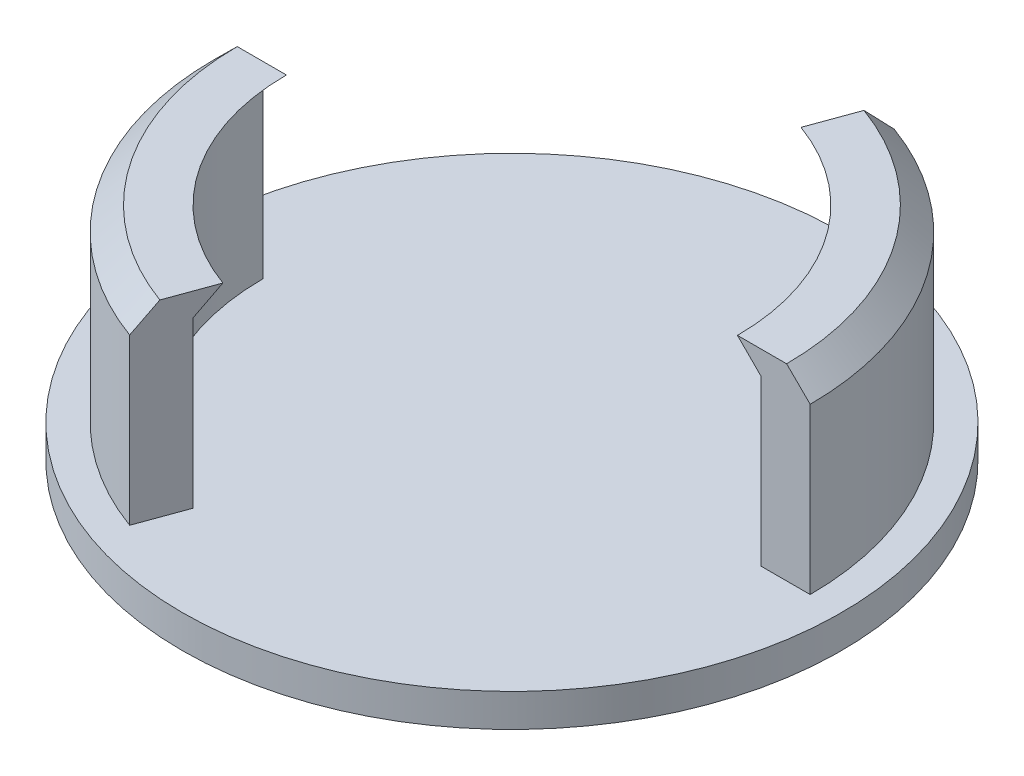
ISO-10303-21;
HEADER;
FILE_DESCRIPTION(('STEP AP214'),'2;1');
FILE_NAME('part.step','',(''),(''),'','','');
FILE_SCHEMA(('AUTOMOTIVE_DESIGN { 1 0 10303 214 1 1 1 1 }'));
ENDSEC;
DATA;
#1=APPLICATION_CONTEXT('core data for automotive mechanical design processes');
#2=APPLICATION_PROTOCOL_DEFINITION('international standard','automotive_design',2000,#1);
#3=PRODUCT_CONTEXT('',#1,'mechanical');
#4=PRODUCT('Part','Part','',(#3));
#5=PRODUCT_RELATED_PRODUCT_CATEGORY('part','',(#4));
#6=PRODUCT_DEFINITION_FORMATION('','',#4);
#7=PRODUCT_DEFINITION_CONTEXT('part definition',#1,'design');
#8=PRODUCT_DEFINITION('design','',#6,#7);
#9=PRODUCT_DEFINITION_SHAPE('','',#8);
#10=(LENGTH_UNIT() NAMED_UNIT(*) SI_UNIT(.MILLI.,.METRE.));
#11=(NAMED_UNIT(*) PLANE_ANGLE_UNIT() SI_UNIT($,.RADIAN.));
#12=(NAMED_UNIT(*) SI_UNIT($,.STERADIAN.) SOLID_ANGLE_UNIT());
#13=UNCERTAINTY_MEASURE_WITH_UNIT(LENGTH_MEASURE(1.E-05),#10,'distance_accuracy_value','');
#14=(GEOMETRIC_REPRESENTATION_CONTEXT(3) GLOBAL_UNCERTAINTY_ASSIGNED_CONTEXT((#13)) GLOBAL_UNIT_ASSIGNED_CONTEXT((#10,
#11,#12)) REPRESENTATION_CONTEXT('',''));
#15=CARTESIAN_POINT('',(0.,0.,0.));
#16=DIRECTION('',(0.,0.,1.));
#17=DIRECTION('',(1.,0.,0.));
#18=AXIS2_PLACEMENT_3D('',#15,#16,#17);
#19=CARTESIAN_POINT('',(0.,2.,0.));
#20=DIRECTION('',(0.,1.,0.));
#21=DIRECTION('',(0.,0.,1.));
#22=AXIS2_PLACEMENT_3D('',#19,#20,#21);
#23=PLANE('',#22);
#24=DIRECTION('',(-0.342020143325666,0.,0.939692620785909));
#25=VECTOR('',#24,1.);
#26=CARTESIAN_POINT('',(0.,2.,0.));
#27=LINE('',#26,#25);
#28=CARTESIAN_POINT('',(-5.16450416421756,2.00000000000001,14.1893585738672));
#29=VERTEX_POINT('',#28);
#30=CARTESIAN_POINT('',(-6.19056459419456,2.00000000000001,17.008436436225));
#31=VERTEX_POINT('',#30);
#32=EDGE_CURVE('E168',#29,#31,#27,.T.);
#33=ORIENTED_EDGE('',*,*,#32,.T.);
#34=CARTESIAN_POINT('',(0.,2.00000000000001,0.));
#35=DIRECTION('',(0.,-1.,0.));
#36=DIRECTION('',(0.,0.,-1.));
#37=AXIS2_PLACEMENT_3D('',#34,#35,#36);
#38=CIRCLE('',#37,18.1);
#39=CARTESIAN_POINT('',(-18.1,2.00000000000001,0.));
#40=VERTEX_POINT('',#39);
#41=EDGE_CURVE('E172',#31,#40,#38,.T.);
#42=ORIENTED_EDGE('',*,*,#41,.T.);
#43=DIRECTION('',(-1.,0.,0.));
#44=VECTOR('',#43,1.);
#45=CARTESIAN_POINT('',(0.,2.,0.));
#46=LINE('',#45,#44);
#47=CARTESIAN_POINT('',(-15.1,2.,0.));
#48=VERTEX_POINT('',#47);
#49=EDGE_CURVE('E154',#48,#40,#46,.T.);
#50=ORIENTED_EDGE('',*,*,#49,.F.);
#51=CARTESIAN_POINT('',(0.,2.00000000000001,0.));
#52=DIRECTION('',(0.,-1.,0.));
#53=DIRECTION('',(0.,0.,-1.));
#54=AXIS2_PLACEMENT_3D('',#51,#52,#53);
#55=CIRCLE('',#54,15.1);
#56=EDGE_CURVE('E139',#29,#48,#55,.T.);
#57=ORIENTED_EDGE('',*,*,#56,.F.);
#58=EDGE_LOOP('',(#33,#42,#50,#57));
#59=FACE_BOUND('',#58,.T.);
#60=CARTESIAN_POINT('',(0.,2.,0.));
#61=DIRECTION('',(0.,1.,0.));
#62=DIRECTION('',(0.,0.,1.));
#63=AXIS2_PLACEMENT_3D('',#60,#61,#62);
#64=CIRCLE('',#63,20.);
#65=CARTESIAN_POINT('',(0.,2.,20.));
#66=VERTEX_POINT('',#65);
#67=EDGE_CURVE('E11',#66,#66,#64,.T.);
#68=ORIENTED_EDGE('',*,*,#67,.T.);
#69=EDGE_LOOP('',(#68));
#70=FACE_BOUND('',#69,.T.);
#71=CARTESIAN_POINT('',(0.,2.00000000000001,0.));
#72=DIRECTION('',(0.,-1.,0.));
#73=DIRECTION('',(0.,0.,-1.));
#74=AXIS2_PLACEMENT_3D('',#71,#72,#73);
#75=CIRCLE('',#74,15.1);
#76=CARTESIAN_POINT('',(5.16450416421756,2.,-14.1893585738672));
#77=VERTEX_POINT('',#76);
#78=CARTESIAN_POINT('',(15.1,2.,0.));
#79=VERTEX_POINT('',#78);
#80=EDGE_CURVE('E58',#77,#79,#75,.T.);
#81=ORIENTED_EDGE('',*,*,#80,.F.);
#82=DIRECTION('',(0.342020143325666,0.,-0.939692620785909));
#83=VECTOR('',#82,1.);
#84=CARTESIAN_POINT('',(0.,2.,0.));
#85=LINE('',#84,#83);
#86=CARTESIAN_POINT('',(6.19056459419456,2.,-17.008436436225));
#87=VERTEX_POINT('',#86);
#88=EDGE_CURVE('E209',#77,#87,#85,.T.);
#89=ORIENTED_EDGE('',*,*,#88,.T.);
#90=CARTESIAN_POINT('',(0.,2.00000000000001,0.));
#91=DIRECTION('',(0.,-1.,0.));
#92=DIRECTION('',(0.,0.,-1.));
#93=AXIS2_PLACEMENT_3D('',#90,#91,#92);
#94=CIRCLE('',#93,18.1);
#95=CARTESIAN_POINT('',(18.1,2.00000000000001,0.));
#96=VERTEX_POINT('',#95);
#97=EDGE_CURVE('E216',#87,#96,#94,.T.);
#98=ORIENTED_EDGE('',*,*,#97,.T.);
#99=DIRECTION('',(1.,0.,0.));
#100=VECTOR('',#99,1.);
#101=CARTESIAN_POINT('',(0.,2.,0.));
#102=LINE('',#101,#100);
#103=EDGE_CURVE('E191',#79,#96,#102,.T.);
#104=ORIENTED_EDGE('',*,*,#103,.F.);
#105=EDGE_LOOP('',(#81,#89,#98,#104));
#106=FACE_BOUND('',#105,.T.);
#107=ADVANCED_FACE('F35',(#59,#70,#106),#23,.T.);
#108=CARTESIAN_POINT('',(0.,2.,0.));
#109=DIRECTION('',(0.,-1.,0.));
#110=DIRECTION('',(0.,0.,-1.));
#111=AXIS2_PLACEMENT_3D('',#108,#109,#110);
#112=CYLINDRICAL_SURFACE('',#111,20.);
#113=ORIENTED_EDGE('',*,*,#67,.F.);
#114=EDGE_LOOP('',(#113));
#115=FACE_BOUND('',#114,.T.);
#116=CARTESIAN_POINT('',(0.,0.,0.));
#117=DIRECTION('',(0.,1.,0.));
#118=DIRECTION('',(0.,0.,1.));
#119=AXIS2_PLACEMENT_3D('',#116,#117,#118);
#120=CIRCLE('',#119,20.);
#121=CARTESIAN_POINT('',(0.,0.,20.));
#122=VERTEX_POINT('',#121);
#123=EDGE_CURVE('E39',#122,#122,#120,.T.);
#124=ORIENTED_EDGE('',*,*,#123,.T.);
#125=EDGE_LOOP('',(#124));
#126=FACE_BOUND('',#125,.T.);
#127=ADVANCED_FACE('F37',(#115,#126),#112,.T.);
#128=CARTESIAN_POINT('',(0.,0.,0.));
#129=DIRECTION('',(0.,1.,0.));
#130=DIRECTION('',(0.,0.,1.));
#131=AXIS2_PLACEMENT_3D('',#128,#129,#130);
#132=PLANE('',#131);
#133=ORIENTED_EDGE('',*,*,#123,.F.);
#134=EDGE_LOOP('',(#133));
#135=FACE_BOUND('',#134,.T.);
#136=ADVANCED_FACE('F230',(#135),#132,.F.);
#137=CARTESIAN_POINT('',(0.,12.,0.));
#138=DIRECTION('',(0.,-1.,0.));
#139=DIRECTION('',(0.,0.,-1.));
#140=AXIS2_PLACEMENT_3D('',#137,#138,#139);
#141=CONICAL_SURFACE('',#140,18.1,0.790976046850301);
#142=CARTESIAN_POINT('',(0.,13.4142135623731,0.));
#143=DIRECTION('',(0.,-1.,0.));
#144=DIRECTION('',(0.,0.,-1.));
#145=AXIS2_PLACEMENT_3D('',#142,#143,#144);
#146=CIRCLE('',#145,16.669921141459);
#147=CARTESIAN_POINT('',(5.70144881802937,13.4142135623731,-15.6646018857121));
#148=VERTEX_POINT('',#147);
#149=CARTESIAN_POINT('',(16.669921141459,13.4142135623731,0.));
#150=VERTEX_POINT('',#149);
#151=EDGE_CURVE('E223',#148,#150,#146,.T.);
#152=ORIENTED_EDGE('',*,*,#151,.T.);
#153=DIRECTION('',(-0.711039919946778,0.703151642422942,0.));
#154=VECTOR('',#153,1.);
#155=CARTESIAN_POINT('',(14.9486690540479,15.1163700775483,0.));
#156=LINE('',#155,#154);
#157=CARTESIAN_POINT('',(18.1,12.,0.));
#158=VERTEX_POINT('',#157);
#159=EDGE_CURVE('E134',#158,#150,#156,.T.);
#160=ORIENTED_EDGE('',*,*,#159,.F.);
#161=CARTESIAN_POINT('',(0.,12.,0.));
#162=DIRECTION('',(0.,-1.,0.));
#163=DIRECTION('',(0.,0.,-1.));
#164=AXIS2_PLACEMENT_3D('',#161,#162,#163);
#165=CIRCLE('',#164,18.1);
#166=CARTESIAN_POINT('',(6.19056459419456,12.,-17.008436436225));
#167=VERTEX_POINT('',#166);
#168=EDGE_CURVE('E214',#167,#158,#165,.T.);
#169=ORIENTED_EDGE('',*,*,#168,.F.);
#170=DIRECTION('',(-0.243189975330467,0.703151642422942,0.668158965858191));
#171=VECTOR('',#170,1.);
#172=CARTESIAN_POINT('',(5.11274593239341,15.1163700775483,-14.0471540006595));
#173=LINE('',#172,#171);
#174=EDGE_CURVE('E197',#167,#148,#173,.T.);
#175=ORIENTED_EDGE('',*,*,#174,.T.);
#176=EDGE_LOOP('',(#152,#160,#169,#175));
#177=FACE_BOUND('',#176,.T.);
#178=ADVANCED_FACE('F232',(#177),#141,.T.);
#179=CARTESIAN_POINT('',(0.,13.4142135623731,0.));
#180=DIRECTION('',(0.,1.,0.));
#181=DIRECTION('',(0.,0.,1.));
#182=AXIS2_PLACEMENT_3D('',#179,#180,#181);
#183=PLANE('',#182);
#184=CARTESIAN_POINT('',(0.,13.4142135623731,0.));
#185=DIRECTION('',(0.,-1.,0.));
#186=DIRECTION('',(0.,0.,-1.));
#187=AXIS2_PLACEMENT_3D('',#184,#185,#186);
#188=CIRCLE('',#187,13.6857864376269);
#189=CARTESIAN_POINT('',(4.68081463892161,13.4142135623731,-12.8604325250899));
#190=VERTEX_POINT('',#189);
#191=CARTESIAN_POINT('',(13.6857864376269,13.4142135623731,0.));
#192=VERTEX_POINT('',#191);
#193=EDGE_CURVE('E221',#190,#192,#188,.T.);
#194=ORIENTED_EDGE('',*,*,#193,.T.);
#195=DIRECTION('',(-1.,0.,0.));
#196=VECTOR('',#195,1.);
#197=CARTESIAN_POINT('',(0.,13.4142135623731,0.));
#198=LINE('',#197,#196);
#199=EDGE_CURVE('E182',#150,#192,#198,.T.);
#200=ORIENTED_EDGE('',*,*,#199,.F.);
#201=ORIENTED_EDGE('',*,*,#151,.F.);
#202=DIRECTION('',(-0.342020143325666,0.,0.939692620785909));
#203=VECTOR('',#202,1.);
#204=CARTESIAN_POINT('',(0.,13.4142135623731,0.));
#205=LINE('',#204,#203);
#206=EDGE_CURVE('E200',#148,#190,#205,.T.);
#207=ORIENTED_EDGE('',*,*,#206,.T.);
#208=EDGE_LOOP('',(#194,#200,#201,#207));
#209=FACE_BOUND('',#208,.T.);
#210=ADVANCED_FACE('F237',(#209),#183,.T.);
#211=CARTESIAN_POINT('',(0.,12.,0.));
#212=DIRECTION('',(0.,-1.,0.));
#213=DIRECTION('',(0.,0.,-1.));
#214=AXIS2_PLACEMENT_3D('',#211,#212,#213);
#215=CONICAL_SURFACE('',#214,15.1,0.785398163397448);
#216=CARTESIAN_POINT('',(0.,12.,0.));
#217=DIRECTION('',(0.,-1.,0.));
#218=DIRECTION('',(0.,0.,-1.));
#219=AXIS2_PLACEMENT_3D('',#216,#217,#218);
#220=CIRCLE('',#219,15.1);
#221=CARTESIAN_POINT('',(5.16450416421756,12.,-14.1893585738672));
#222=VERTEX_POINT('',#221);
#223=CARTESIAN_POINT('',(15.1,12.,0.));
#224=VERTEX_POINT('',#223);
#225=EDGE_CURVE('E219',#222,#224,#220,.T.);
#226=ORIENTED_EDGE('',*,*,#225,.T.);
#227=DIRECTION('',(-0.707106781186548,0.707106781186548,0.));
#228=VECTOR('',#227,1.);
#229=CARTESIAN_POINT('',(13.55,13.55,0.));
#230=LINE('',#229,#228);
#231=EDGE_CURVE('E185',#224,#192,#230,.T.);
#232=ORIENTED_EDGE('',*,*,#231,.T.);
#233=ORIENTED_EDGE('',*,*,#193,.F.);
#234=DIRECTION('',(-0.241844762647973,0.707106781186548,0.664463024388675));
#235=VECTOR('',#234,1.);
#236=CARTESIAN_POINT('',(4.63437294206278,13.55,-12.7328350116491));
#237=LINE('',#236,#235);
#238=EDGE_CURVE('E203',#222,#190,#237,.T.);
#239=ORIENTED_EDGE('',*,*,#238,.F.);
#240=EDGE_LOOP('',(#226,#232,#233,#239));
#241=FACE_BOUND('',#240,.T.);
#242=ADVANCED_FACE('F249',(#241),#215,.F.);
#243=CARTESIAN_POINT('',(0.,0.,0.));
#244=DIRECTION('',(0.,-1.,0.));
#245=DIRECTION('',(0.,0.,-1.));
#246=AXIS2_PLACEMENT_3D('',#243,#244,#245);
#247=CYLINDRICAL_SURFACE('',#246,15.1);
#248=ORIENTED_EDGE('',*,*,#80,.T.);
#249=DIRECTION('',(0.,1.,0.));
#250=VECTOR('',#249,1.);
#251=CARTESIAN_POINT('',(15.1,0.,0.));
#252=LINE('',#251,#250);
#253=EDGE_CURVE('E188',#79,#224,#252,.T.);
#254=ORIENTED_EDGE('',*,*,#253,.T.);
#255=ORIENTED_EDGE('',*,*,#225,.F.);
#256=DIRECTION('',(0.,1.,0.));
#257=VECTOR('',#256,1.);
#258=CARTESIAN_POINT('',(5.16450416421756,0.,-14.1893585738672));
#259=LINE('',#258,#257);
#260=EDGE_CURVE('E206',#77,#222,#259,.T.);
#261=ORIENTED_EDGE('',*,*,#260,.F.);
#262=EDGE_LOOP('',(#248,#254,#255,#261));
#263=FACE_BOUND('',#262,.T.);
#264=ADVANCED_FACE('F253',(#263),#247,.F.);
#265=CARTESIAN_POINT('',(0.,0.,0.));
#266=DIRECTION('',(0.,-1.,0.));
#267=DIRECTION('',(0.,0.,-1.));
#268=AXIS2_PLACEMENT_3D('',#265,#266,#267);
#269=CYLINDRICAL_SURFACE('',#268,18.1);
#270=DIRECTION('',(0.,1.,0.));
#271=VECTOR('',#270,1.);
#272=CARTESIAN_POINT('',(6.19056459419456,0.,-17.008436436225));
#273=LINE('',#272,#271);
#274=EDGE_CURVE('E211',#87,#167,#273,.T.);
#275=ORIENTED_EDGE('',*,*,#274,.T.);
#276=ORIENTED_EDGE('',*,*,#168,.T.);
#277=DIRECTION('',(0.,1.,0.));
#278=VECTOR('',#277,1.);
#279=CARTESIAN_POINT('',(18.1,0.,0.));
#280=LINE('',#279,#278);
#281=EDGE_CURVE('E194',#96,#158,#280,.T.);
#282=ORIENTED_EDGE('',*,*,#281,.F.);
#283=ORIENTED_EDGE('',*,*,#97,.F.);
#284=EDGE_LOOP('',(#275,#276,#282,#283));
#285=FACE_BOUND('',#284,.T.);
#286=ADVANCED_FACE('F257',(#285),#269,.T.);
#287=CARTESIAN_POINT('',(0.,0.,0.));
#288=DIRECTION('',(0.939692620785909,0.,0.342020143325666));
#289=DIRECTION('',(0.342020143325666,0.,-0.939692620785909));
#290=AXIS2_PLACEMENT_3D('',#287,#288,#289);
#291=PLANE('',#290);
#292=ORIENTED_EDGE('',*,*,#174,.F.);
#293=ORIENTED_EDGE('',*,*,#274,.F.);
#294=ORIENTED_EDGE('',*,*,#88,.F.);
#295=ORIENTED_EDGE('',*,*,#260,.T.);
#296=ORIENTED_EDGE('',*,*,#238,.T.);
#297=ORIENTED_EDGE('',*,*,#206,.F.);
#298=EDGE_LOOP('',(#292,#293,#294,#295,#296,#297));
#299=FACE_BOUND('',#298,.T.);
#300=ADVANCED_FACE('F260',(#299),#291,.F.);
#301=CARTESIAN_POINT('',(0.,0.,0.));
#302=DIRECTION('',(0.,0.,1.));
#303=DIRECTION('',(1.,0.,0.));
#304=AXIS2_PLACEMENT_3D('',#301,#302,#303);
#305=PLANE('',#304);
#306=ORIENTED_EDGE('',*,*,#159,.T.);
#307=ORIENTED_EDGE('',*,*,#199,.T.);
#308=ORIENTED_EDGE('',*,*,#231,.F.);
#309=ORIENTED_EDGE('',*,*,#253,.F.);
#310=ORIENTED_EDGE('',*,*,#103,.T.);
#311=ORIENTED_EDGE('',*,*,#281,.T.);
#312=EDGE_LOOP('',(#306,#307,#308,#309,#310,#311));
#313=FACE_BOUND('',#312,.T.);
#314=ADVANCED_FACE('F265',(#313),#305,.T.);
#315=CARTESIAN_POINT('',(0.,0.,0.));
#316=DIRECTION('',(0.,-1.,0.));
#317=DIRECTION('',(0.,0.,-1.));
#318=AXIS2_PLACEMENT_3D('',#315,#316,#317);
#319=CYLINDRICAL_SURFACE('',#318,15.1);
#320=CARTESIAN_POINT('',(0.,12.,0.));
#321=DIRECTION('',(0.,-1.,0.));
#322=DIRECTION('',(0.,0.,-1.));
#323=AXIS2_PLACEMENT_3D('',#320,#321,#322);
#324=CIRCLE('',#323,15.1);
#325=CARTESIAN_POINT('',(-5.16450416421756,12.,14.1893585738672));
#326=VERTEX_POINT('',#325);
#327=CARTESIAN_POINT('',(-15.1,12.,0.));
#328=VERTEX_POINT('',#327);
#329=EDGE_CURVE('E126',#326,#328,#324,.T.);
#330=ORIENTED_EDGE('',*,*,#329,.F.);
#331=DIRECTION('',(0.,1.,0.));
#332=VECTOR('',#331,1.);
#333=CARTESIAN_POINT('',(-5.16450416421756,0.,14.1893585738672));
#334=LINE('',#333,#332);
#335=EDGE_CURVE('E156',#29,#326,#334,.T.);
#336=ORIENTED_EDGE('',*,*,#335,.F.);
#337=ORIENTED_EDGE('',*,*,#56,.T.);
#338=DIRECTION('',(0.,1.,0.));
#339=VECTOR('',#338,1.);
#340=CARTESIAN_POINT('',(-15.1,0.,0.));
#341=LINE('',#340,#339);
#342=EDGE_CURVE('E50',#48,#328,#341,.T.);
#343=ORIENTED_EDGE('',*,*,#342,.T.);
#344=EDGE_LOOP('',(#330,#336,#337,#343));
#345=FACE_BOUND('',#344,.T.);
#346=ADVANCED_FACE('F137',(#345),#319,.F.);
#347=CARTESIAN_POINT('',(0.,12.,0.));
#348=DIRECTION('',(0.,-1.,0.));
#349=DIRECTION('',(0.,0.,-1.));
#350=AXIS2_PLACEMENT_3D('',#347,#348,#349);
#351=CONICAL_SURFACE('',#350,15.1,0.785398163397448);
#352=CARTESIAN_POINT('',(0.,13.4142135623731,0.));
#353=DIRECTION('',(0.,-1.,0.));
#354=DIRECTION('',(0.,0.,-1.));
#355=AXIS2_PLACEMENT_3D('',#352,#353,#354);
#356=CIRCLE('',#355,13.6857864376269);
#357=CARTESIAN_POINT('',(-4.68081463892161,13.4142135623731,12.8604325250899));
#358=VERTEX_POINT('',#357);
#359=CARTESIAN_POINT('',(-13.6857864376269,13.4142135623731,0.));
#360=VERTEX_POINT('',#359);
#361=EDGE_CURVE('E135',#358,#360,#356,.T.);
#362=ORIENTED_EDGE('',*,*,#361,.F.);
#363=DIRECTION('',(0.241844762647973,0.707106781186548,-0.664463024388675));
#364=VECTOR('',#363,1.);
#365=CARTESIAN_POINT('',(-4.63437294206278,13.55,12.7328350116491));
#366=LINE('',#365,#364);
#367=EDGE_CURVE('E131',#326,#358,#366,.T.);
#368=ORIENTED_EDGE('',*,*,#367,.F.);
#369=ORIENTED_EDGE('',*,*,#329,.T.);
#370=DIRECTION('',(0.707106781186548,0.707106781186548,0.));
#371=VECTOR('',#370,1.);
#372=CARTESIAN_POINT('',(-13.55,13.55,0.));
#373=LINE('',#372,#371);
#374=EDGE_CURVE('E128',#328,#360,#373,.T.);
#375=ORIENTED_EDGE('',*,*,#374,.T.);
#376=EDGE_LOOP('',(#362,#368,#369,#375));
#377=FACE_BOUND('',#376,.T.);
#378=ADVANCED_FACE('F127',(#377),#351,.F.);
#379=CARTESIAN_POINT('',(0.,13.4142135623731,0.));
#380=DIRECTION('',(0.,1.,0.));
#381=DIRECTION('',(0.,0.,1.));
#382=AXIS2_PLACEMENT_3D('',#379,#380,#381);
#383=PLANE('',#382);
#384=CARTESIAN_POINT('',(0.,13.4142135623731,0.));
#385=DIRECTION('',(0.,-1.,0.));
#386=DIRECTION('',(0.,0.,-1.));
#387=AXIS2_PLACEMENT_3D('',#384,#385,#386);
#388=CIRCLE('',#387,16.669921141459);
#389=CARTESIAN_POINT('',(-5.70144881802937,13.4142135623731,15.6646018857121));
#390=VERTEX_POINT('',#389);
#391=CARTESIAN_POINT('',(-16.669921141459,13.4142135623731,0.));
#392=VERTEX_POINT('',#391);
#393=EDGE_CURVE('E177',#390,#392,#388,.T.);
#394=ORIENTED_EDGE('',*,*,#393,.F.);
#395=DIRECTION('',(0.342020143325666,0.,-0.939692620785909));
#396=VECTOR('',#395,1.);
#397=CARTESIAN_POINT('',(0.,13.4142135623731,0.));
#398=LINE('',#397,#396);
#399=EDGE_CURVE('E159',#390,#358,#398,.T.);
#400=ORIENTED_EDGE('',*,*,#399,.T.);
#401=ORIENTED_EDGE('',*,*,#361,.T.);
#402=DIRECTION('',(1.,0.,0.));
#403=VECTOR('',#402,1.);
#404=CARTESIAN_POINT('',(0.,13.4142135623731,0.));
#405=LINE('',#404,#403);
#406=EDGE_CURVE('E145',#392,#360,#405,.T.);
#407=ORIENTED_EDGE('',*,*,#406,.F.);
#408=EDGE_LOOP('',(#394,#400,#401,#407));
#409=FACE_BOUND('',#408,.T.);
#410=ADVANCED_FACE('F272',(#409),#383,.T.);
#411=CARTESIAN_POINT('',(0.,12.,0.));
#412=DIRECTION('',(0.,-1.,0.));
#413=DIRECTION('',(0.,0.,-1.));
#414=AXIS2_PLACEMENT_3D('',#411,#412,#413);
#415=CONICAL_SURFACE('',#414,18.1,0.790976046850303);
#416=CARTESIAN_POINT('',(0.,12.,0.));
#417=DIRECTION('',(0.,-1.,0.));
#418=DIRECTION('',(0.,0.,-1.));
#419=AXIS2_PLACEMENT_3D('',#416,#417,#418);
#420=CIRCLE('',#419,18.1);
#421=CARTESIAN_POINT('',(-6.19056459419456,12.,17.008436436225));
#422=VERTEX_POINT('',#421);
#423=CARTESIAN_POINT('',(-18.1,12.,0.));
#424=VERTEX_POINT('',#423);
#425=EDGE_CURVE('E175',#422,#424,#420,.T.);
#426=ORIENTED_EDGE('',*,*,#425,.F.);
#427=DIRECTION('',(0.243189975330467,0.703151642422942,-0.668158965858191));
#428=VECTOR('',#427,1.);
#429=CARTESIAN_POINT('',(-5.11274593239341,15.1163700775483,14.0471540006595));
#430=LINE('',#429,#428);
#431=EDGE_CURVE('E162',#422,#390,#430,.T.);
#432=ORIENTED_EDGE('',*,*,#431,.T.);
#433=ORIENTED_EDGE('',*,*,#393,.T.);
#434=DIRECTION('',(0.711039919946778,0.703151642422942,0.));
#435=VECTOR('',#434,1.);
#436=CARTESIAN_POINT('',(-14.9486690540479,15.1163700775483,0.));
#437=LINE('',#436,#435);
#438=EDGE_CURVE('E147',#424,#392,#437,.T.);
#439=ORIENTED_EDGE('',*,*,#438,.F.);
#440=EDGE_LOOP('',(#426,#432,#433,#439));
#441=FACE_BOUND('',#440,.T.);
#442=ADVANCED_FACE('F275',(#441),#415,.T.);
#443=CARTESIAN_POINT('',(0.,0.,0.));
#444=DIRECTION('',(0.,-1.,0.));
#445=DIRECTION('',(0.,0.,-1.));
#446=AXIS2_PLACEMENT_3D('',#443,#444,#445);
#447=CYLINDRICAL_SURFACE('',#446,18.1);
#448=ORIENTED_EDGE('',*,*,#41,.F.);
#449=DIRECTION('',(0.,1.,0.));
#450=VECTOR('',#449,1.);
#451=CARTESIAN_POINT('',(-6.19056459419456,0.,17.008436436225));
#452=LINE('',#451,#450);
#453=EDGE_CURVE('E165',#31,#422,#452,.T.);
#454=ORIENTED_EDGE('',*,*,#453,.T.);
#455=ORIENTED_EDGE('',*,*,#425,.T.);
#456=DIRECTION('',(0.,1.,0.));
#457=VECTOR('',#456,1.);
#458=CARTESIAN_POINT('',(-18.1,0.,0.));
#459=LINE('',#458,#457);
#460=EDGE_CURVE('E151',#40,#424,#459,.T.);
#461=ORIENTED_EDGE('',*,*,#460,.F.);
#462=EDGE_LOOP('',(#448,#454,#455,#461));
#463=FACE_BOUND('',#462,.T.);
#464=ADVANCED_FACE('F279',(#463),#447,.T.);
#465=CARTESIAN_POINT('',(0.,0.,0.));
#466=DIRECTION('',(0.939692620785909,0.,0.342020143325666));
#467=DIRECTION('',(0.342020143325666,0.,-0.939692620785909));
#468=AXIS2_PLACEMENT_3D('',#465,#466,#467);
#469=PLANE('',#468);
#470=ORIENTED_EDGE('',*,*,#335,.T.);
#471=ORIENTED_EDGE('',*,*,#367,.T.);
#472=ORIENTED_EDGE('',*,*,#399,.F.);
#473=ORIENTED_EDGE('',*,*,#431,.F.);
#474=ORIENTED_EDGE('',*,*,#453,.F.);
#475=ORIENTED_EDGE('',*,*,#32,.F.);
#476=EDGE_LOOP('',(#470,#471,#472,#473,#474,#475));
#477=FACE_BOUND('',#476,.T.);
#478=ADVANCED_FACE('F283',(#477),#469,.T.);
#479=CARTESIAN_POINT('',(0.,0.,0.));
#480=DIRECTION('',(0.,0.,1.));
#481=DIRECTION('',(1.,0.,0.));
#482=AXIS2_PLACEMENT_3D('',#479,#480,#481);
#483=PLANE('',#482);
#484=ORIENTED_EDGE('',*,*,#342,.F.);
#485=ORIENTED_EDGE('',*,*,#49,.T.);
#486=ORIENTED_EDGE('',*,*,#460,.T.);
#487=ORIENTED_EDGE('',*,*,#438,.T.);
#488=ORIENTED_EDGE('',*,*,#406,.T.);
#489=ORIENTED_EDGE('',*,*,#374,.F.);
#490=EDGE_LOOP('',(#484,#485,#486,#487,#488,#489));
#491=FACE_BOUND('',#490,.T.);
#492=ADVANCED_FACE('F142',(#491),#483,.F.);
#493=CLOSED_SHELL('',(#107,#127,#136,#178,#210,#242,#264,#286,#300,#314,#346,#378,#410,#442,
#464,#478,#492));
#494=MANIFOLD_SOLID_BREP('B2',#493);
#495=ADVANCED_BREP_SHAPE_REPRESENTATION('',(#18,#494),#14);
#496=SHAPE_DEFINITION_REPRESENTATION(#9,#495);
ENDSEC;
END-ISO-10303-21;
